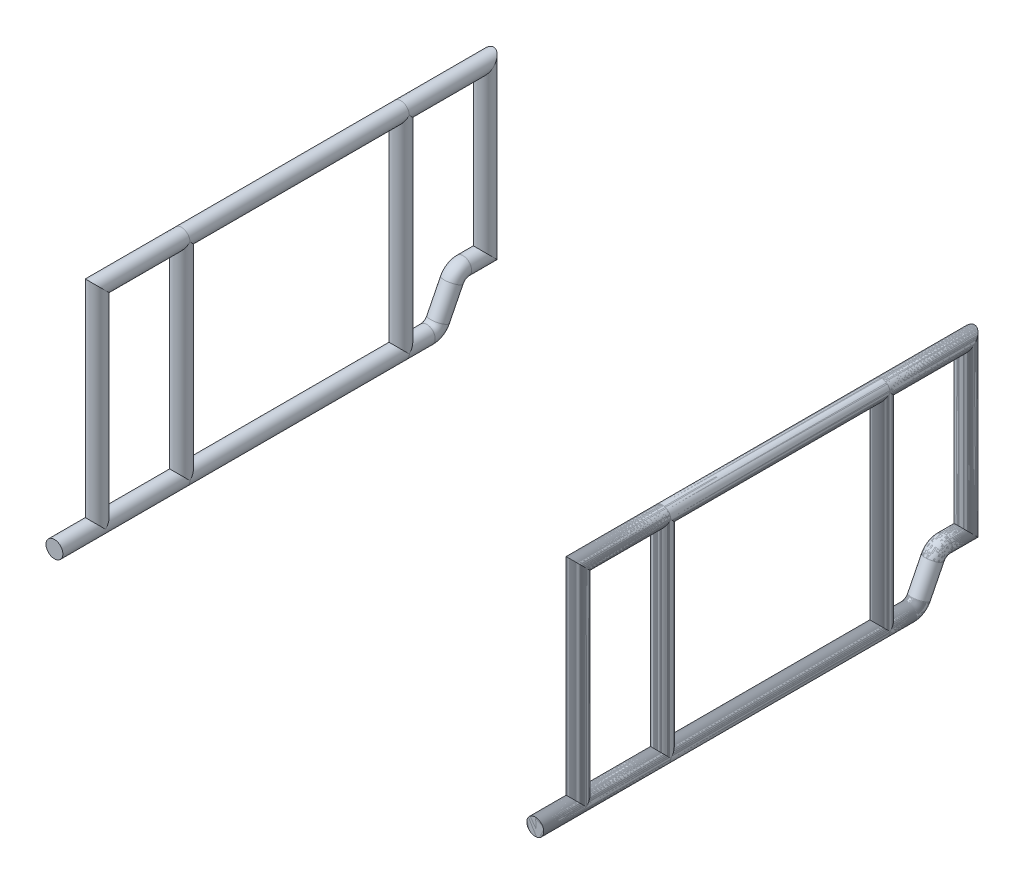
ISO-10303-21;
HEADER;
FILE_DESCRIPTION(('STEP AP214'),'2;1');
FILE_NAME('part.step','',(''),(''),'','','');
FILE_SCHEMA(('AUTOMOTIVE_DESIGN { 1 0 10303 214 1 1 1 1 }'));
ENDSEC;
DATA;
#1=APPLICATION_CONTEXT('core data for automotive mechanical design processes');
#2=APPLICATION_PROTOCOL_DEFINITION('international standard','automotive_design',2000,#1);
#3=PRODUCT_CONTEXT('',#1,'mechanical');
#4=PRODUCT('Part','Part','',(#3));
#5=PRODUCT_RELATED_PRODUCT_CATEGORY('part','',(#4));
#6=PRODUCT_DEFINITION_FORMATION('','',#4);
#7=PRODUCT_DEFINITION_CONTEXT('part definition',#1,'design');
#8=PRODUCT_DEFINITION('design','',#6,#7);
#9=PRODUCT_DEFINITION_SHAPE('','',#8);
#10=(LENGTH_UNIT() NAMED_UNIT(*) SI_UNIT(.MILLI.,.METRE.));
#11=(NAMED_UNIT(*) PLANE_ANGLE_UNIT() SI_UNIT($,.RADIAN.));
#12=(NAMED_UNIT(*) SI_UNIT($,.STERADIAN.) SOLID_ANGLE_UNIT());
#13=UNCERTAINTY_MEASURE_WITH_UNIT(LENGTH_MEASURE(1.E-05),#10,'distance_accuracy_value','');
#14=(GEOMETRIC_REPRESENTATION_CONTEXT(3) GLOBAL_UNCERTAINTY_ASSIGNED_CONTEXT((#13)) GLOBAL_UNIT_ASSIGNED_CONTEXT((#10,
#11,#12)) REPRESENTATION_CONTEXT('',''));
#15=CARTESIAN_POINT('',(0.,0.,0.));
#16=DIRECTION('',(0.,0.,1.));
#17=DIRECTION('',(1.,0.,0.));
#18=AXIS2_PLACEMENT_3D('',#15,#16,#17);
#19=CARTESIAN_POINT('',(-570.,267.1,0.));
#20=DIRECTION('',(0.,-1.,0.));
#21=DIRECTION('',(0.,0.,-1.));
#22=AXIS2_PLACEMENT_3D('',#19,#20,#21);
#23=CYLINDRICAL_SURFACE('',#22,10.);
#24=CARTESIAN_POINT('',(-570.,245.,0.));
#25=DIRECTION('',(0.,0.707106781186548,-0.707106781186548));
#26=DIRECTION('',(0.,-0.707106781186548,-0.707106781186548));
#27=AXIS2_PLACEMENT_3D('',#24,#25,#26);
#28=ELLIPSE('',#27,14.1421356237309,10.);
#29=CARTESIAN_POINT('',(-570.,235.,-10.0000000000001));
#30=VERTEX_POINT('',#29);
#31=EDGE_CURVE('E134',#30,#30,#28,.T.);
#32=ORIENTED_EDGE('',*,*,#31,.F.);
#33=EDGE_LOOP('',(#32));
#34=FACE_BOUND('',#33,.T.);
#35=CARTESIAN_POINT('',(-570.,0.,0.));
#36=DIRECTION('',(0.,0.707106781186547,-0.707106781186547));
#37=DIRECTION('',(0.,-0.707106781186547,-0.707106781186547));
#38=AXIS2_PLACEMENT_3D('',#35,#36,#37);
#39=ELLIPSE('',#38,14.1421356237309,10.);
#40=CARTESIAN_POINT('',(-580.,0.,0.));
#41=VERTEX_POINT('',#40);
#42=CARTESIAN_POINT('',(-560.,0.,0.));
#43=VERTEX_POINT('',#42);
#44=EDGE_CURVE('E12',#41,#43,#39,.T.);
#45=ORIENTED_EDGE('',*,*,#44,.T.);
#46=CARTESIAN_POINT('',(-570.,0.,0.));
#47=DIRECTION('',(0.,0.707106781186547,0.707106781186547));
#48=DIRECTION('',(0.,0.707106781186548,-0.707106781186548));
#49=AXIS2_PLACEMENT_3D('',#46,#47,#48);
#50=ELLIPSE('',#49,14.142135623731,10.);
#51=EDGE_CURVE('E67',#43,#41,#50,.T.);
#52=ORIENTED_EDGE('',*,*,#51,.T.);
#53=EDGE_LOOP('',(#45,#52));
#54=FACE_BOUND('',#53,.T.);
#55=ADVANCED_FACE('F54',(#34,#54),#23,.T.);
#56=CARTESIAN_POINT('',(-570.,245.,-482.1));
#57=DIRECTION('',(0.,0.,1.));
#58=DIRECTION('',(-1.,0.,0.));
#59=AXIS2_PLACEMENT_3D('',#56,#57,#58);
#60=CYLINDRICAL_SURFACE('',#59,10.);
#61=CARTESIAN_POINT('',(-570.,245.,-460.));
#62=DIRECTION('',(0.,-0.707106781186547,-0.707106781186547));
#63=DIRECTION('',(0.,0.707106781186548,-0.707106781186548));
#64=AXIS2_PLACEMENT_3D('',#61,#62,#63);
#65=ELLIPSE('',#64,14.142135623731,10.);
#66=CARTESIAN_POINT('',(-570.,255.,-470.));
#67=VERTEX_POINT('',#66);
#68=EDGE_CURVE('E101',#67,#67,#65,.T.);
#69=ORIENTED_EDGE('',*,*,#68,.F.);
#70=EDGE_LOOP('',(#69));
#71=FACE_BOUND('',#70,.T.);
#72=CARTESIAN_POINT('',(-570.,245.,-360.));
#73=DIRECTION('',(0.,0.,1.));
#74=DIRECTION('',(-1.,0.,0.));
#75=AXIS2_PLACEMENT_3D('',#72,#73,#74);
#76=CIRCLE('',#75,10.);
#77=CARTESIAN_POINT('',(-560.,245.,-360.));
#78=VERTEX_POINT('',#77);
#79=CARTESIAN_POINT('',(-580.,245.,-360.));
#80=VERTEX_POINT('',#79);
#81=EDGE_CURVE('E130',#78,#80,#76,.T.);
#82=ORIENTED_EDGE('',*,*,#81,.F.);
#83=CARTESIAN_POINT('',(-570.,245.,-360.));
#84=DIRECTION('',(0.,0.707106781186547,-0.707106781186547));
#85=DIRECTION('',(0.,0.707106781186547,0.707106781186547));
#86=AXIS2_PLACEMENT_3D('',#83,#84,#85);
#87=ELLIPSE('',#86,14.142135623731,10.);
#88=EDGE_CURVE('E193',#80,#78,#87,.F.);
#89=ORIENTED_EDGE('',*,*,#88,.F.);
#90=EDGE_LOOP('',(#82,#89));
#91=FACE_BOUND('',#90,.T.);
#92=ADVANCED_FACE('F104',(#71,#91),#60,.T.);
#93=CARTESIAN_POINT('',(-570.,245.,-360.));
#94=DIRECTION('',(0.,0.,1.));
#95=DIRECTION('',(-1.,0.,0.));
#96=AXIS2_PLACEMENT_3D('',#93,#94,#95);
#97=CYLINDRICAL_SURFACE('',#96,10.);
#98=CARTESIAN_POINT('',(-570.,245.,-99.9999999999999));
#99=DIRECTION('',(0.,0.,1.));
#100=DIRECTION('',(-1.,0.,0.));
#101=AXIS2_PLACEMENT_3D('',#98,#99,#100);
#102=CIRCLE('',#101,10.);
#103=CARTESIAN_POINT('',(-560.,245.,-99.9999999999999));
#104=VERTEX_POINT('',#103);
#105=CARTESIAN_POINT('',(-580.,245.,-99.9999999999999));
#106=VERTEX_POINT('',#105);
#107=EDGE_CURVE('E127',#104,#106,#102,.T.);
#108=ORIENTED_EDGE('',*,*,#107,.F.);
#109=CARTESIAN_POINT('',(-570.,245.,-100.));
#110=DIRECTION('',(0.,0.707106781186547,-0.707106781186547));
#111=DIRECTION('',(0.,0.707106781186547,0.707106781186547));
#112=AXIS2_PLACEMENT_3D('',#109,#110,#111);
#113=ELLIPSE('',#112,14.1421356237309,10.);
#114=EDGE_CURVE('E132',#106,#104,#113,.F.);
#115=ORIENTED_EDGE('',*,*,#114,.F.);
#116=EDGE_LOOP('',(#108,#115));
#117=FACE_BOUND('',#116,.T.);
#118=ORIENTED_EDGE('',*,*,#81,.T.);
#119=CARTESIAN_POINT('',(-570.,245.,-360.));
#120=DIRECTION('',(0.,-0.707106781186547,-0.707106781186547));
#121=DIRECTION('',(0.,-0.707106781186547,0.707106781186547));
#122=AXIS2_PLACEMENT_3D('',#119,#120,#121);
#123=ELLIPSE('',#122,14.142135623731,10.);
#124=EDGE_CURVE('E74',#78,#80,#123,.T.);
#125=ORIENTED_EDGE('',*,*,#124,.F.);
#126=EDGE_LOOP('',(#118,#125));
#127=FACE_BOUND('',#126,.T.);
#128=ADVANCED_FACE('F110',(#117,#127),#97,.T.);
#129=CARTESIAN_POINT('',(-570.,245.,-99.9999999999999));
#130=DIRECTION('',(0.,0.,1.));
#131=DIRECTION('',(-1.,0.,0.));
#132=AXIS2_PLACEMENT_3D('',#129,#130,#131);
#133=CYLINDRICAL_SURFACE('',#132,10.);
#134=ORIENTED_EDGE('',*,*,#107,.T.);
#135=CARTESIAN_POINT('',(-570.,245.,-100.));
#136=DIRECTION('',(0.,-0.707106781186547,-0.707106781186547));
#137=DIRECTION('',(0.,-0.707106781186547,0.707106781186547));
#138=AXIS2_PLACEMENT_3D('',#135,#136,#137);
#139=ELLIPSE('',#138,14.1421356237309,10.);
#140=EDGE_CURVE('E137',#104,#106,#139,.T.);
#141=ORIENTED_EDGE('',*,*,#140,.F.);
#142=EDGE_LOOP('',(#134,#141));
#143=FACE_BOUND('',#142,.T.);
#144=ORIENTED_EDGE('',*,*,#31,.T.);
#145=EDGE_LOOP('',(#144));
#146=FACE_BOUND('',#145,.T.);
#147=ADVANCED_FACE('F56',(#143,#146),#133,.T.);
#148=CARTESIAN_POINT('',(-570.,26.9,-460.));
#149=DIRECTION('',(0.,1.,0.));
#150=DIRECTION('',(0.,0.,1.));
#151=AXIS2_PLACEMENT_3D('',#148,#149,#150);
#152=CYLINDRICAL_SURFACE('',#151,10.);
#153=CARTESIAN_POINT('',(-570.,49.,-460.));
#154=DIRECTION('',(0.,-0.707106781186547,0.707106781186547));
#155=DIRECTION('',(0.,-0.707106781186548,-0.707106781186548));
#156=AXIS2_PLACEMENT_3D('',#153,#154,#155);
#157=ELLIPSE('',#156,14.142135623731,10.);
#158=CARTESIAN_POINT('',(-570.,39.,-470.));
#159=VERTEX_POINT('',#158);
#160=EDGE_CURVE('E143',#159,#159,#157,.T.);
#161=ORIENTED_EDGE('',*,*,#160,.F.);
#162=EDGE_LOOP('',(#161));
#163=FACE_BOUND('',#162,.T.);
#164=ORIENTED_EDGE('',*,*,#68,.T.);
#165=EDGE_LOOP('',(#164));
#166=FACE_BOUND('',#165,.T.);
#167=ADVANCED_FACE('F115',(#163,#166),#152,.T.);
#168=CARTESIAN_POINT('',(-570.,0.,22.1));
#169=DIRECTION('',(0.,0.,-1.));
#170=DIRECTION('',(1.,0.,0.));
#171=AXIS2_PLACEMENT_3D('',#168,#169,#170);
#172=CYLINDRICAL_SURFACE('',#171,10.);
#173=ORIENTED_EDGE('',*,*,#51,.F.);
#174=ORIENTED_EDGE('',*,*,#44,.F.);
#175=EDGE_LOOP('',(#173,#174));
#176=FACE_BOUND('',#175,.T.);
#177=CARTESIAN_POINT('',(-570.,0.,-100.));
#178=DIRECTION('',(0.,0.,-1.));
#179=DIRECTION('',(-1.,0.,0.));
#180=AXIS2_PLACEMENT_3D('',#177,#178,#179);
#181=CIRCLE('',#180,10.);
#182=CARTESIAN_POINT('',(-560.,0.,-100.));
#183=VERTEX_POINT('',#182);
#184=CARTESIAN_POINT('',(-580.,0.,-100.));
#185=VERTEX_POINT('',#184);
#186=EDGE_CURVE('E100',#183,#185,#181,.T.);
#187=ORIENTED_EDGE('',*,*,#186,.F.);
#188=CARTESIAN_POINT('',(-570.,0.,-100.));
#189=DIRECTION('',(0.,-0.707106781186547,0.707106781186547));
#190=DIRECTION('',(0.,-0.707106781186547,-0.707106781186547));
#191=AXIS2_PLACEMENT_3D('',#188,#189,#190);
#192=ELLIPSE('',#191,14.1421356237309,10.);
#193=EDGE_CURVE('E190',#185,#183,#192,.F.);
#194=ORIENTED_EDGE('',*,*,#193,.F.);
#195=EDGE_LOOP('',(#187,#194));
#196=FACE_BOUND('',#195,.T.);
#197=CARTESIAN_POINT('',(-570.,0.,50.6581024421646));
#198=DIRECTION('',(0.,0.,-1.));
#199=DIRECTION('',(-1.,0.,0.));
#200=AXIS2_PLACEMENT_3D('',#197,#198,#199);
#201=CIRCLE('',#200,10.);
#202=CARTESIAN_POINT('',(-580.,0.,50.6581024421646));
#203=VERTEX_POINT('',#202);
#204=EDGE_CURVE('E156',#203,#203,#201,.T.);
#205=ORIENTED_EDGE('',*,*,#204,.T.);
#206=EDGE_LOOP('',(#205));
#207=FACE_BOUND('',#206,.T.);
#208=ADVANCED_FACE('F98',(#176,#196,#207),#172,.T.);
#209=CARTESIAN_POINT('',(-570.,0.,-100.));
#210=DIRECTION('',(0.,0.,-1.));
#211=DIRECTION('',(1.,0.,0.));
#212=AXIS2_PLACEMENT_3D('',#209,#210,#211);
#213=CYLINDRICAL_SURFACE('',#212,10.);
#214=CARTESIAN_POINT('',(-570.,0.,-360.));
#215=DIRECTION('',(0.,0.,-1.));
#216=DIRECTION('',(-1.,0.,0.));
#217=AXIS2_PLACEMENT_3D('',#214,#215,#216);
#218=CIRCLE('',#217,10.);
#219=CARTESIAN_POINT('',(-560.,0.,-360.));
#220=VERTEX_POINT('',#219);
#221=CARTESIAN_POINT('',(-580.,0.,-360.));
#222=VERTEX_POINT('',#221);
#223=EDGE_CURVE('E155',#220,#222,#218,.T.);
#224=ORIENTED_EDGE('',*,*,#223,.F.);
#225=CARTESIAN_POINT('',(-570.,0.,-360.));
#226=DIRECTION('',(0.,-0.707106781186547,0.707106781186547));
#227=DIRECTION('',(0.,-0.707106781186547,-0.707106781186547));
#228=AXIS2_PLACEMENT_3D('',#225,#226,#227);
#229=ELLIPSE('',#228,14.142135623731,10.);
#230=EDGE_CURVE('E148',#222,#220,#229,.F.);
#231=ORIENTED_EDGE('',*,*,#230,.F.);
#232=EDGE_LOOP('',(#224,#231));
#233=FACE_BOUND('',#232,.T.);
#234=ORIENTED_EDGE('',*,*,#186,.T.);
#235=CARTESIAN_POINT('',(-570.,0.,-100.));
#236=DIRECTION('',(0.,0.707106781186547,0.707106781186547));
#237=DIRECTION('',(0.,0.707106781186547,-0.707106781186547));
#238=AXIS2_PLACEMENT_3D('',#235,#236,#237);
#239=ELLIPSE('',#238,14.1421356237309,10.);
#240=EDGE_CURVE('E142',#183,#185,#239,.T.);
#241=ORIENTED_EDGE('',*,*,#240,.F.);
#242=EDGE_LOOP('',(#234,#241));
#243=FACE_BOUND('',#242,.T.);
#244=ADVANCED_FACE('F153',(#233,#243),#213,.T.);
#245=CARTESIAN_POINT('',(-570.,0.,-360.));
#246=DIRECTION('',(0.,0.,-1.));
#247=DIRECTION('',(1.,0.,0.));
#248=AXIS2_PLACEMENT_3D('',#245,#246,#247);
#249=CYLINDRICAL_SURFACE('',#248,10.);
#250=CARTESIAN_POINT('',(-570.,0.,-390.738546015918));
#251=DIRECTION('',(0.,0.,-1.));
#252=DIRECTION('',(-1.,0.,0.));
#253=AXIS2_PLACEMENT_3D('',#250,#251,#252);
#254=CIRCLE('',#253,10.);
#255=CARTESIAN_POINT('',(-570.,-10.,-390.738546015918));
#256=VERTEX_POINT('',#255);
#257=EDGE_CURVE('E159',#256,#256,#254,.T.);
#258=ORIENTED_EDGE('',*,*,#257,.F.);
#259=EDGE_LOOP('',(#258));
#260=FACE_BOUND('',#259,.T.);
#261=ORIENTED_EDGE('',*,*,#223,.T.);
#262=CARTESIAN_POINT('',(-570.,0.,-360.));
#263=DIRECTION('',(0.,0.707106781186547,0.707106781186547));
#264=DIRECTION('',(0.,0.707106781186547,-0.707106781186547));
#265=AXIS2_PLACEMENT_3D('',#262,#263,#264);
#266=ELLIPSE('',#265,14.142135623731,10.);
#267=EDGE_CURVE('E62',#220,#222,#266,.T.);
#268=ORIENTED_EDGE('',*,*,#267,.F.);
#269=EDGE_LOOP('',(#261,#268));
#270=FACE_BOUND('',#269,.T.);
#271=ADVANCED_FACE('F158',(#260,#270),#249,.T.);
#272=CARTESIAN_POINT('',(-570.,15.,-390.738546015918));
#273=DIRECTION('',(-1.,0.,0.));
#274=DIRECTION('',(0.,0.,-1.));
#275=AXIS2_PLACEMENT_3D('',#272,#273,#274);
#276=TOROIDAL_SURFACE('',#275,15.,10.);
#277=CARTESIAN_POINT('',(-570.,8.28007333101597,-404.14908610808));
#278=DIRECTION('',(0.,0.894036006144115,-0.447995111265602));
#279=DIRECTION('',(-1.,0.,0.));
#280=AXIS2_PLACEMENT_3D('',#277,#278,#279);
#281=CIRCLE('',#280,10.);
#282=CARTESIAN_POINT('',(-570.,3.80012221835996,-413.089446169521));
#283=VERTEX_POINT('',#282);
#284=EDGE_CURVE('E162',#283,#283,#281,.T.);
#285=CARTESIAN_POINT('',(-570.,15.,-390.738546015918));
#286=DIRECTION('',(-1.,0.,0.));
#287=DIRECTION('',(0.,0.,-1.));
#288=AXIS2_PLACEMENT_3D('',#285,#286,#287);
#289=CIRCLE('',#288,25.);
#290=EDGE_CURVE('',#283,#256,#289,.T.);
#291=ORIENTED_EDGE('',*,*,#284,.F.);
#292=ORIENTED_EDGE('',*,*,#257,.T.);
#293=ORIENTED_EDGE('',*,*,#290,.T.);
#294=ORIENTED_EDGE('',*,*,#290,.F.);
#295=EDGE_LOOP('',(#291,#293,#292,#294));
#296=FACE_BOUND('',#295,.T.);
#297=ADVANCED_FACE('F221',(#296),#276,.T.);
#298=CARTESIAN_POINT('',(-570.,8.28007333101597,-404.14908610808));
#299=DIRECTION('',(0.,0.894036006144113,-0.447995111265606));
#300=DIRECTION('',(0.,0.447995111265607,0.894036006144113));
#301=AXIS2_PLACEMENT_3D('',#298,#299,#300);
#302=CYLINDRICAL_SURFACE('',#301,10.);
#303=CARTESIAN_POINT('',(-570.,40.719926668984,-420.404466882129));
#304=DIRECTION('',(0.,0.894036006144113,-0.447995111265606));
#305=DIRECTION('',(-1.,0.,0.));
#306=AXIS2_PLACEMENT_3D('',#303,#304,#305);
#307=CIRCLE('',#306,10.);
#308=CARTESIAN_POINT('',(-570.,45.19987778164,-411.464106820688));
#309=VERTEX_POINT('',#308);
#310=EDGE_CURVE('E170',#309,#309,#307,.T.);
#311=ORIENTED_EDGE('',*,*,#310,.F.);
#312=EDGE_LOOP('',(#311));
#313=FACE_BOUND('',#312,.T.);
#314=ORIENTED_EDGE('',*,*,#284,.T.);
#315=EDGE_LOOP('',(#314));
#316=FACE_BOUND('',#315,.T.);
#317=ADVANCED_FACE('F225',(#313,#316),#302,.T.);
#318=CARTESIAN_POINT('',(-570.,34.,-433.815006974291));
#319=DIRECTION('',(1.,0.,0.));
#320=DIRECTION('',(0.,0.,1.));
#321=AXIS2_PLACEMENT_3D('',#318,#319,#320);
#322=TOROIDAL_SURFACE('',#321,15.,10.);
#323=CARTESIAN_POINT('',(-570.,49.,-433.815006974291));
#324=DIRECTION('',(0.,0.,-1.));
#325=DIRECTION('',(-1.,0.,0.));
#326=AXIS2_PLACEMENT_3D('',#323,#324,#325);
#327=CIRCLE('',#326,10.);
#328=CARTESIAN_POINT('',(-570.,59.,-433.815006974291));
#329=VERTEX_POINT('',#328);
#330=EDGE_CURVE('E173',#329,#329,#327,.T.);
#331=CARTESIAN_POINT('',(-570.,34.,-433.815006974291));
#332=DIRECTION('',(1.,0.,0.));
#333=DIRECTION('',(0.,0.,1.));
#334=AXIS2_PLACEMENT_3D('',#331,#332,#333);
#335=CIRCLE('',#334,25.);
#336=EDGE_CURVE('',#329,#309,#335,.T.);
#337=ORIENTED_EDGE('',*,*,#330,.F.);
#338=ORIENTED_EDGE('',*,*,#310,.T.);
#339=ORIENTED_EDGE('',*,*,#336,.T.);
#340=ORIENTED_EDGE('',*,*,#336,.F.);
#341=EDGE_LOOP('',(#337,#339,#338,#340));
#342=FACE_BOUND('',#341,.T.);
#343=ADVANCED_FACE('F215',(#342),#322,.T.);
#344=CARTESIAN_POINT('',(-570.,49.,-433.815006974291));
#345=DIRECTION('',(0.,0.,-1.));
#346=DIRECTION('',(1.,0.,0.));
#347=AXIS2_PLACEMENT_3D('',#344,#345,#346);
#348=CYLINDRICAL_SURFACE('',#347,10.);
#349=ORIENTED_EDGE('',*,*,#330,.T.);
#350=EDGE_LOOP('',(#349));
#351=FACE_BOUND('',#350,.T.);
#352=ORIENTED_EDGE('',*,*,#160,.T.);
#353=EDGE_LOOP('',(#352));
#354=FACE_BOUND('',#353,.T.);
#355=ADVANCED_FACE('F211',(#351,#354),#348,.T.);
#356=CARTESIAN_POINT('',(-570.,0.,-100.));
#357=DIRECTION('',(0.,1.,0.));
#358=DIRECTION('',(0.,0.,1.));
#359=AXIS2_PLACEMENT_3D('',#356,#357,#358);
#360=CYLINDRICAL_SURFACE('',#359,10.);
#361=ORIENTED_EDGE('',*,*,#193,.T.);
#362=ORIENTED_EDGE('',*,*,#240,.T.);
#363=EDGE_LOOP('',(#361,#362));
#364=FACE_BOUND('',#363,.T.);
#365=ORIENTED_EDGE('',*,*,#114,.T.);
#366=ORIENTED_EDGE('',*,*,#140,.T.);
#367=EDGE_LOOP('',(#365,#366));
#368=FACE_BOUND('',#367,.T.);
#369=ADVANCED_FACE('F206',(#364,#368),#360,.T.);
#370=CARTESIAN_POINT('',(-570.,0.,-360.));
#371=DIRECTION('',(0.,1.,0.));
#372=DIRECTION('',(0.,0.,1.));
#373=AXIS2_PLACEMENT_3D('',#370,#371,#372);
#374=CYLINDRICAL_SURFACE('',#373,10.);
#375=ORIENTED_EDGE('',*,*,#230,.T.);
#376=ORIENTED_EDGE('',*,*,#267,.T.);
#377=EDGE_LOOP('',(#375,#376));
#378=FACE_BOUND('',#377,.T.);
#379=ORIENTED_EDGE('',*,*,#88,.T.);
#380=ORIENTED_EDGE('',*,*,#124,.T.);
#381=EDGE_LOOP('',(#379,#380));
#382=FACE_BOUND('',#381,.T.);
#383=ADVANCED_FACE('F147',(#378,#382),#374,.T.);
#384=CARTESIAN_POINT('',(-570.,0.,50.6581024421646));
#385=DIRECTION('',(0.,0.,1.));
#386=DIRECTION('',(-1.,0.,0.));
#387=AXIS2_PLACEMENT_3D('',#384,#385,#386);
#388=PLANE('',#387);
#389=ORIENTED_EDGE('',*,*,#204,.F.);
#390=EDGE_LOOP('',(#389));
#391=FACE_BOUND('',#390,.T.);
#392=ADVANCED_FACE('F200',(#391),#388,.T.);
#393=CLOSED_SHELL('',(#55,#92,#128,#147,#167,#208,#244,#271,#297,#317,#343,#355,#369,#383,#392));
#394=MANIFOLD_SOLID_BREP('B2',#393);
#395=CARTESIAN_POINT('',(0.,267.1,0.));
#396=DIRECTION('',(0.,-1.,0.));
#397=DIRECTION('',(0.,0.,-1.));
#398=AXIS2_PLACEMENT_3D('',#395,#396,#397);
#399=CYLINDRICAL_SURFACE('',#398,10.);
#400=CARTESIAN_POINT('',(0.,245.,0.));
#401=DIRECTION('',(0.,0.707106781186548,-0.707106781186548));
#402=DIRECTION('',(0.,-0.707106781186548,-0.707106781186548));
#403=AXIS2_PLACEMENT_3D('',#400,#401,#402);
#404=ELLIPSE('',#403,14.1421356237309,10.);
#405=CARTESIAN_POINT('',(0.,235.,-10.0000000000001));
#406=VERTEX_POINT('',#405);
#407=EDGE_CURVE('E419',#406,#406,#404,.T.);
#408=ORIENTED_EDGE('',*,*,#407,.F.);
#409=EDGE_LOOP('',(#408));
#410=FACE_BOUND('',#409,.T.);
#411=CARTESIAN_POINT('',(0.,0.,0.));
#412=DIRECTION('',(0.,0.707106781186547,-0.707106781186547));
#413=DIRECTION('',(0.,-0.707106781186547,-0.707106781186547));
#414=AXIS2_PLACEMENT_3D('',#411,#412,#413);
#415=ELLIPSE('',#414,14.1421356237309,10.);
#416=CARTESIAN_POINT('',(-10.,0.,0.));
#417=VERTEX_POINT('',#416);
#418=CARTESIAN_POINT('',(10.,0.,0.));
#419=VERTEX_POINT('',#418);
#420=EDGE_CURVE('E52',#417,#419,#415,.T.);
#421=ORIENTED_EDGE('',*,*,#420,.T.);
#422=CARTESIAN_POINT('',(0.,0.,0.));
#423=DIRECTION('',(0.,0.707106781186547,0.707106781186547));
#424=DIRECTION('',(0.,0.707106781186548,-0.707106781186548));
#425=AXIS2_PLACEMENT_3D('',#422,#423,#424);
#426=ELLIPSE('',#425,14.142135623731,10.);
#427=EDGE_CURVE('E352',#419,#417,#426,.T.);
#428=ORIENTED_EDGE('',*,*,#427,.T.);
#429=EDGE_LOOP('',(#421,#428));
#430=FACE_BOUND('',#429,.T.);
#431=ADVANCED_FACE('F339',(#410,#430),#399,.T.);
#432=CARTESIAN_POINT('',(0.,245.,-482.1));
#433=DIRECTION('',(0.,0.,1.));
#434=DIRECTION('',(-1.,0.,0.));
#435=AXIS2_PLACEMENT_3D('',#432,#433,#434);
#436=CYLINDRICAL_SURFACE('',#435,10.);
#437=CARTESIAN_POINT('',(0.,245.,-460.));
#438=DIRECTION('',(0.,-0.707106781186547,-0.707106781186547));
#439=DIRECTION('',(0.,0.707106781186548,-0.707106781186548));
#440=AXIS2_PLACEMENT_3D('',#437,#438,#439);
#441=ELLIPSE('',#440,14.142135623731,10.);
#442=CARTESIAN_POINT('',(0.,255.,-470.));
#443=VERTEX_POINT('',#442);
#444=EDGE_CURVE('E386',#443,#443,#441,.T.);
#445=ORIENTED_EDGE('',*,*,#444,.F.);
#446=EDGE_LOOP('',(#445));
#447=FACE_BOUND('',#446,.T.);
#448=CARTESIAN_POINT('',(0.,245.,-360.));
#449=DIRECTION('',(0.,0.,1.));
#450=DIRECTION('',(-1.,0.,0.));
#451=AXIS2_PLACEMENT_3D('',#448,#449,#450);
#452=CIRCLE('',#451,10.);
#453=CARTESIAN_POINT('',(10.,245.,-360.));
#454=VERTEX_POINT('',#453);
#455=CARTESIAN_POINT('',(-10.,245.,-360.));
#456=VERTEX_POINT('',#455);
#457=EDGE_CURVE('E415',#454,#456,#452,.T.);
#458=ORIENTED_EDGE('',*,*,#457,.F.);
#459=CARTESIAN_POINT('',(0.,245.,-360.));
#460=DIRECTION('',(0.,0.707106781186547,-0.707106781186547));
#461=DIRECTION('',(0.,0.707106781186547,0.707106781186547));
#462=AXIS2_PLACEMENT_3D('',#459,#460,#461);
#463=ELLIPSE('',#462,14.142135623731,10.);
#464=EDGE_CURVE('E478',#456,#454,#463,.F.);
#465=ORIENTED_EDGE('',*,*,#464,.F.);
#466=EDGE_LOOP('',(#458,#465));
#467=FACE_BOUND('',#466,.T.);
#468=ADVANCED_FACE('F389',(#447,#467),#436,.T.);
#469=CARTESIAN_POINT('',(0.,245.,-360.));
#470=DIRECTION('',(0.,0.,1.));
#471=DIRECTION('',(-1.,0.,0.));
#472=AXIS2_PLACEMENT_3D('',#469,#470,#471);
#473=CYLINDRICAL_SURFACE('',#472,10.);
#474=CARTESIAN_POINT('',(0.,245.,-99.9999999999999));
#475=DIRECTION('',(0.,0.,1.));
#476=DIRECTION('',(-1.,0.,0.));
#477=AXIS2_PLACEMENT_3D('',#474,#475,#476);
#478=CIRCLE('',#477,10.);
#479=CARTESIAN_POINT('',(10.,245.,-99.9999999999999));
#480=VERTEX_POINT('',#479);
#481=CARTESIAN_POINT('',(-10.,245.,-99.9999999999999));
#482=VERTEX_POINT('',#481);
#483=EDGE_CURVE('E412',#480,#482,#478,.T.);
#484=ORIENTED_EDGE('',*,*,#483,.F.);
#485=CARTESIAN_POINT('',(0.,245.,-100.));
#486=DIRECTION('',(0.,0.707106781186547,-0.707106781186547));
#487=DIRECTION('',(0.,0.707106781186547,0.707106781186547));
#488=AXIS2_PLACEMENT_3D('',#485,#486,#487);
#489=ELLIPSE('',#488,14.1421356237309,10.);
#490=EDGE_CURVE('E417',#482,#480,#489,.F.);
#491=ORIENTED_EDGE('',*,*,#490,.F.);
#492=EDGE_LOOP('',(#484,#491));
#493=FACE_BOUND('',#492,.T.);
#494=ORIENTED_EDGE('',*,*,#457,.T.);
#495=CARTESIAN_POINT('',(0.,245.,-360.));
#496=DIRECTION('',(0.,-0.707106781186547,-0.707106781186547));
#497=DIRECTION('',(0.,-0.707106781186547,0.707106781186547));
#498=AXIS2_PLACEMENT_3D('',#495,#496,#497);
#499=ELLIPSE('',#498,14.142135623731,10.);
#500=EDGE_CURVE('E359',#454,#456,#499,.T.);
#501=ORIENTED_EDGE('',*,*,#500,.F.);
#502=EDGE_LOOP('',(#494,#501));
#503=FACE_BOUND('',#502,.T.);
#504=ADVANCED_FACE('F395',(#493,#503),#473,.T.);
#505=CARTESIAN_POINT('',(0.,245.,-99.9999999999999));
#506=DIRECTION('',(0.,0.,1.));
#507=DIRECTION('',(-1.,0.,0.));
#508=AXIS2_PLACEMENT_3D('',#505,#506,#507);
#509=CYLINDRICAL_SURFACE('',#508,10.);
#510=ORIENTED_EDGE('',*,*,#483,.T.);
#511=CARTESIAN_POINT('',(0.,245.,-100.));
#512=DIRECTION('',(0.,-0.707106781186547,-0.707106781186547));
#513=DIRECTION('',(0.,-0.707106781186547,0.707106781186547));
#514=AXIS2_PLACEMENT_3D('',#511,#512,#513);
#515=ELLIPSE('',#514,14.1421356237309,10.);
#516=EDGE_CURVE('E422',#480,#482,#515,.T.);
#517=ORIENTED_EDGE('',*,*,#516,.F.);
#518=EDGE_LOOP('',(#510,#517));
#519=FACE_BOUND('',#518,.T.);
#520=ORIENTED_EDGE('',*,*,#407,.T.);
#521=EDGE_LOOP('',(#520));
#522=FACE_BOUND('',#521,.T.);
#523=ADVANCED_FACE('F341',(#519,#522),#509,.T.);
#524=CARTESIAN_POINT('',(0.,26.9,-460.));
#525=DIRECTION('',(0.,1.,0.));
#526=DIRECTION('',(0.,0.,1.));
#527=AXIS2_PLACEMENT_3D('',#524,#525,#526);
#528=CYLINDRICAL_SURFACE('',#527,10.);
#529=CARTESIAN_POINT('',(0.,49.,-460.));
#530=DIRECTION('',(0.,-0.707106781186547,0.707106781186547));
#531=DIRECTION('',(0.,-0.707106781186548,-0.707106781186548));
#532=AXIS2_PLACEMENT_3D('',#529,#530,#531);
#533=ELLIPSE('',#532,14.142135623731,10.);
#534=CARTESIAN_POINT('',(0.,39.,-470.));
#535=VERTEX_POINT('',#534);
#536=EDGE_CURVE('E428',#535,#535,#533,.T.);
#537=ORIENTED_EDGE('',*,*,#536,.F.);
#538=EDGE_LOOP('',(#537));
#539=FACE_BOUND('',#538,.T.);
#540=ORIENTED_EDGE('',*,*,#444,.T.);
#541=EDGE_LOOP('',(#540));
#542=FACE_BOUND('',#541,.T.);
#543=ADVANCED_FACE('F400',(#539,#542),#528,.T.);
#544=CARTESIAN_POINT('',(0.,0.,22.1));
#545=DIRECTION('',(0.,0.,-1.));
#546=DIRECTION('',(1.,0.,0.));
#547=AXIS2_PLACEMENT_3D('',#544,#545,#546);
#548=CYLINDRICAL_SURFACE('',#547,10.);
#549=ORIENTED_EDGE('',*,*,#427,.F.);
#550=ORIENTED_EDGE('',*,*,#420,.F.);
#551=EDGE_LOOP('',(#549,#550));
#552=FACE_BOUND('',#551,.T.);
#553=CARTESIAN_POINT('',(0.,0.,-100.));
#554=DIRECTION('',(0.,0.,-1.));
#555=DIRECTION('',(-1.,0.,0.));
#556=AXIS2_PLACEMENT_3D('',#553,#554,#555);
#557=CIRCLE('',#556,10.);
#558=CARTESIAN_POINT('',(10.,0.,-100.));
#559=VERTEX_POINT('',#558);
#560=CARTESIAN_POINT('',(-10.,0.,-100.));
#561=VERTEX_POINT('',#560);
#562=EDGE_CURVE('E385',#559,#561,#557,.T.);
#563=ORIENTED_EDGE('',*,*,#562,.F.);
#564=CARTESIAN_POINT('',(0.,0.,-100.));
#565=DIRECTION('',(0.,-0.707106781186547,0.707106781186547));
#566=DIRECTION('',(0.,-0.707106781186547,-0.707106781186547));
#567=AXIS2_PLACEMENT_3D('',#564,#565,#566);
#568=ELLIPSE('',#567,14.1421356237309,10.);
#569=EDGE_CURVE('E475',#561,#559,#568,.F.);
#570=ORIENTED_EDGE('',*,*,#569,.F.);
#571=EDGE_LOOP('',(#563,#570));
#572=FACE_BOUND('',#571,.T.);
#573=CARTESIAN_POINT('',(0.,0.,50.6581024421646));
#574=DIRECTION('',(0.,0.,-1.));
#575=DIRECTION('',(-1.,0.,0.));
#576=AXIS2_PLACEMENT_3D('',#573,#574,#575);
#577=CIRCLE('',#576,10.);
#578=CARTESIAN_POINT('',(-10.,0.,50.6581024421646));
#579=VERTEX_POINT('',#578);
#580=EDGE_CURVE('E441',#579,#579,#577,.T.);
#581=ORIENTED_EDGE('',*,*,#580,.T.);
#582=EDGE_LOOP('',(#581));
#583=FACE_BOUND('',#582,.T.);
#584=ADVANCED_FACE('F383',(#552,#572,#583),#548,.T.);
#585=CARTESIAN_POINT('',(0.,0.,-100.));
#586=DIRECTION('',(0.,0.,-1.));
#587=DIRECTION('',(1.,0.,0.));
#588=AXIS2_PLACEMENT_3D('',#585,#586,#587);
#589=CYLINDRICAL_SURFACE('',#588,10.);
#590=CARTESIAN_POINT('',(0.,0.,-360.));
#591=DIRECTION('',(0.,0.,-1.));
#592=DIRECTION('',(-1.,0.,0.));
#593=AXIS2_PLACEMENT_3D('',#590,#591,#592);
#594=CIRCLE('',#593,10.);
#595=CARTESIAN_POINT('',(10.,0.,-360.));
#596=VERTEX_POINT('',#595);
#597=CARTESIAN_POINT('',(-10.,0.,-360.));
#598=VERTEX_POINT('',#597);
#599=EDGE_CURVE('E440',#596,#598,#594,.T.);
#600=ORIENTED_EDGE('',*,*,#599,.F.);
#601=CARTESIAN_POINT('',(0.,0.,-360.));
#602=DIRECTION('',(0.,-0.707106781186547,0.707106781186547));
#603=DIRECTION('',(0.,-0.707106781186547,-0.707106781186547));
#604=AXIS2_PLACEMENT_3D('',#601,#602,#603);
#605=ELLIPSE('',#604,14.142135623731,10.);
#606=EDGE_CURVE('E433',#598,#596,#605,.F.);
#607=ORIENTED_EDGE('',*,*,#606,.F.);
#608=EDGE_LOOP('',(#600,#607));
#609=FACE_BOUND('',#608,.T.);
#610=ORIENTED_EDGE('',*,*,#562,.T.);
#611=CARTESIAN_POINT('',(0.,0.,-100.));
#612=DIRECTION('',(0.,0.707106781186547,0.707106781186547));
#613=DIRECTION('',(0.,0.707106781186547,-0.707106781186547));
#614=AXIS2_PLACEMENT_3D('',#611,#612,#613);
#615=ELLIPSE('',#614,14.1421356237309,10.);
#616=EDGE_CURVE('E427',#559,#561,#615,.T.);
#617=ORIENTED_EDGE('',*,*,#616,.F.);
#618=EDGE_LOOP('',(#610,#617));
#619=FACE_BOUND('',#618,.T.);
#620=ADVANCED_FACE('F438',(#609,#619),#589,.T.);
#621=CARTESIAN_POINT('',(0.,0.,-360.));
#622=DIRECTION('',(0.,0.,-1.));
#623=DIRECTION('',(1.,0.,0.));
#624=AXIS2_PLACEMENT_3D('',#621,#622,#623);
#625=CYLINDRICAL_SURFACE('',#624,10.);
#626=CARTESIAN_POINT('',(0.,0.,-390.738546015918));
#627=DIRECTION('',(0.,0.,-1.));
#628=DIRECTION('',(-1.,0.,0.));
#629=AXIS2_PLACEMENT_3D('',#626,#627,#628);
#630=CIRCLE('',#629,10.);
#631=CARTESIAN_POINT('',(0.,-10.,-390.738546015918));
#632=VERTEX_POINT('',#631);
#633=EDGE_CURVE('E444',#632,#632,#630,.T.);
#634=ORIENTED_EDGE('',*,*,#633,.F.);
#635=EDGE_LOOP('',(#634));
#636=FACE_BOUND('',#635,.T.);
#637=ORIENTED_EDGE('',*,*,#599,.T.);
#638=CARTESIAN_POINT('',(0.,0.,-360.));
#639=DIRECTION('',(0.,0.707106781186547,0.707106781186547));
#640=DIRECTION('',(0.,0.707106781186547,-0.707106781186547));
#641=AXIS2_PLACEMENT_3D('',#638,#639,#640);
#642=ELLIPSE('',#641,14.142135623731,10.);
#643=EDGE_CURVE('E347',#596,#598,#642,.T.);
#644=ORIENTED_EDGE('',*,*,#643,.F.);
#645=EDGE_LOOP('',(#637,#644));
#646=FACE_BOUND('',#645,.T.);
#647=ADVANCED_FACE('F443',(#636,#646),#625,.T.);
#648=CARTESIAN_POINT('',(0.,15.,-390.738546015918));
#649=DIRECTION('',(-1.,0.,0.));
#650=DIRECTION('',(0.,0.,-1.));
#651=AXIS2_PLACEMENT_3D('',#648,#649,#650);
#652=TOROIDAL_SURFACE('',#651,15.,10.);
#653=CARTESIAN_POINT('',(0.,8.28007333101597,-404.14908610808));
#654=DIRECTION('',(0.,0.894036006144115,-0.447995111265602));
#655=DIRECTION('',(-1.,0.,0.));
#656=AXIS2_PLACEMENT_3D('',#653,#654,#655);
#657=CIRCLE('',#656,10.);
#658=CARTESIAN_POINT('',(0.,3.80012221835996,-413.089446169521));
#659=VERTEX_POINT('',#658);
#660=EDGE_CURVE('E447',#659,#659,#657,.T.);
#661=CARTESIAN_POINT('',(0.,15.,-390.738546015918));
#662=DIRECTION('',(-1.,0.,0.));
#663=DIRECTION('',(0.,0.,-1.));
#664=AXIS2_PLACEMENT_3D('',#661,#662,#663);
#665=CIRCLE('',#664,25.);
#666=EDGE_CURVE('',#659,#632,#665,.T.);
#667=ORIENTED_EDGE('',*,*,#660,.F.);
#668=ORIENTED_EDGE('',*,*,#633,.T.);
#669=ORIENTED_EDGE('',*,*,#666,.T.);
#670=ORIENTED_EDGE('',*,*,#666,.F.);
#671=EDGE_LOOP('',(#667,#669,#668,#670));
#672=FACE_BOUND('',#671,.T.);
#673=ADVANCED_FACE('F506',(#672),#652,.T.);
#674=CARTESIAN_POINT('',(0.,8.28007333101597,-404.14908610808));
#675=DIRECTION('',(0.,0.894036006144113,-0.447995111265606));
#676=DIRECTION('',(0.,0.447995111265607,0.894036006144113));
#677=AXIS2_PLACEMENT_3D('',#674,#675,#676);
#678=CYLINDRICAL_SURFACE('',#677,10.);
#679=CARTESIAN_POINT('',(0.,40.719926668984,-420.404466882129));
#680=DIRECTION('',(0.,0.894036006144113,-0.447995111265606));
#681=DIRECTION('',(-1.,0.,0.));
#682=AXIS2_PLACEMENT_3D('',#679,#680,#681);
#683=CIRCLE('',#682,10.);
#684=CARTESIAN_POINT('',(0.,45.19987778164,-411.464106820688));
#685=VERTEX_POINT('',#684);
#686=EDGE_CURVE('E455',#685,#685,#683,.T.);
#687=ORIENTED_EDGE('',*,*,#686,.F.);
#688=EDGE_LOOP('',(#687));
#689=FACE_BOUND('',#688,.T.);
#690=ORIENTED_EDGE('',*,*,#660,.T.);
#691=EDGE_LOOP('',(#690));
#692=FACE_BOUND('',#691,.T.);
#693=ADVANCED_FACE('F510',(#689,#692),#678,.T.);
#694=CARTESIAN_POINT('',(0.,34.,-433.815006974291));
#695=DIRECTION('',(1.,0.,0.));
#696=DIRECTION('',(0.,0.,1.));
#697=AXIS2_PLACEMENT_3D('',#694,#695,#696);
#698=TOROIDAL_SURFACE('',#697,15.,10.);
#699=CARTESIAN_POINT('',(0.,49.,-433.815006974291));
#700=DIRECTION('',(0.,0.,-1.));
#701=DIRECTION('',(-1.,0.,0.));
#702=AXIS2_PLACEMENT_3D('',#699,#700,#701);
#703=CIRCLE('',#702,10.);
#704=CARTESIAN_POINT('',(0.,59.,-433.815006974291));
#705=VERTEX_POINT('',#704);
#706=EDGE_CURVE('E458',#705,#705,#703,.T.);
#707=CARTESIAN_POINT('',(0.,34.,-433.815006974291));
#708=DIRECTION('',(1.,0.,0.));
#709=DIRECTION('',(0.,0.,1.));
#710=AXIS2_PLACEMENT_3D('',#707,#708,#709);
#711=CIRCLE('',#710,25.);
#712=EDGE_CURVE('',#705,#685,#711,.T.);
#713=ORIENTED_EDGE('',*,*,#706,.F.);
#714=ORIENTED_EDGE('',*,*,#686,.T.);
#715=ORIENTED_EDGE('',*,*,#712,.T.);
#716=ORIENTED_EDGE('',*,*,#712,.F.);
#717=EDGE_LOOP('',(#713,#715,#714,#716));
#718=FACE_BOUND('',#717,.T.);
#719=ADVANCED_FACE('F500',(#718),#698,.T.);
#720=CARTESIAN_POINT('',(0.,49.,-433.815006974291));
#721=DIRECTION('',(0.,0.,-1.));
#722=DIRECTION('',(1.,0.,0.));
#723=AXIS2_PLACEMENT_3D('',#720,#721,#722);
#724=CYLINDRICAL_SURFACE('',#723,10.);
#725=ORIENTED_EDGE('',*,*,#706,.T.);
#726=EDGE_LOOP('',(#725));
#727=FACE_BOUND('',#726,.T.);
#728=ORIENTED_EDGE('',*,*,#536,.T.);
#729=EDGE_LOOP('',(#728));
#730=FACE_BOUND('',#729,.T.);
#731=ADVANCED_FACE('F496',(#727,#730),#724,.T.);
#732=CARTESIAN_POINT('',(0.,0.,-100.));
#733=DIRECTION('',(0.,1.,0.));
#734=DIRECTION('',(0.,0.,1.));
#735=AXIS2_PLACEMENT_3D('',#732,#733,#734);
#736=CYLINDRICAL_SURFACE('',#735,10.);
#737=ORIENTED_EDGE('',*,*,#569,.T.);
#738=ORIENTED_EDGE('',*,*,#616,.T.);
#739=EDGE_LOOP('',(#737,#738));
#740=FACE_BOUND('',#739,.T.);
#741=ORIENTED_EDGE('',*,*,#490,.T.);
#742=ORIENTED_EDGE('',*,*,#516,.T.);
#743=EDGE_LOOP('',(#741,#742));
#744=FACE_BOUND('',#743,.T.);
#745=ADVANCED_FACE('F491',(#740,#744),#736,.T.);
#746=CARTESIAN_POINT('',(0.,0.,-360.));
#747=DIRECTION('',(0.,1.,0.));
#748=DIRECTION('',(0.,0.,1.));
#749=AXIS2_PLACEMENT_3D('',#746,#747,#748);
#750=CYLINDRICAL_SURFACE('',#749,10.);
#751=ORIENTED_EDGE('',*,*,#606,.T.);
#752=ORIENTED_EDGE('',*,*,#643,.T.);
#753=EDGE_LOOP('',(#751,#752));
#754=FACE_BOUND('',#753,.T.);
#755=ORIENTED_EDGE('',*,*,#464,.T.);
#756=ORIENTED_EDGE('',*,*,#500,.T.);
#757=EDGE_LOOP('',(#755,#756));
#758=FACE_BOUND('',#757,.T.);
#759=ADVANCED_FACE('F432',(#754,#758),#750,.T.);
#760=CARTESIAN_POINT('',(0.,0.,50.6581024421646));
#761=DIRECTION('',(0.,0.,1.));
#762=DIRECTION('',(-1.,0.,0.));
#763=AXIS2_PLACEMENT_3D('',#760,#761,#762);
#764=PLANE('',#763);
#765=ORIENTED_EDGE('',*,*,#580,.F.);
#766=EDGE_LOOP('',(#765));
#767=FACE_BOUND('',#766,.T.);
#768=ADVANCED_FACE('F485',(#767),#764,.T.);
#769=CLOSED_SHELL('',(#431,#468,#504,#523,#543,#584,#620,#647,#673,#693,#719,#731,#745,#759,#768));
#770=MANIFOLD_SOLID_BREP('B6',#769);
#771=CARTESIAN_POINT('',(0.,267.1,0.));
#772=DIRECTION('',(0.,-1.,0.));
#773=DIRECTION('',(0.,0.,-1.));
#774=AXIS2_PLACEMENT_3D('',#771,#772,#773);
#775=CYLINDRICAL_SURFACE('',#774,10.);
#776=CARTESIAN_POINT('',(0.,245.,0.));
#777=DIRECTION('',(0.,-0.707106781186548,0.707106781186548));
#778=DIRECTION('',(0.,-0.707106781186548,-0.707106781186548));
#779=AXIS2_PLACEMENT_3D('',#776,#777,#778);
#780=ELLIPSE('',#779,14.1421356237309,10.);
#781=CARTESIAN_POINT('',(0.,235.,-10.0000000000001));
#782=VERTEX_POINT('',#781);
#783=EDGE_CURVE('E715',#782,#782,#780,.T.);
#784=ORIENTED_EDGE('',*,*,#783,.T.);
#785=EDGE_LOOP('',(#784));
#786=FACE_BOUND('',#785,.T.);
#787=CARTESIAN_POINT('',(0.,0.,0.));
#788=DIRECTION('',(0.,-0.707106781186547,0.707106781186547));
#789=DIRECTION('',(0.,-0.707106781186547,-0.707106781186547));
#790=AXIS2_PLACEMENT_3D('',#787,#788,#789);
#791=ELLIPSE('',#790,14.1421356237309,10.);
#792=CARTESIAN_POINT('',(10.,0.,0.));
#793=VERTEX_POINT('',#792);
#794=CARTESIAN_POINT('',(-10.,0.,0.));
#795=VERTEX_POINT('',#794);
#796=EDGE_CURVE('E337',#793,#795,#791,.T.);
#797=ORIENTED_EDGE('',*,*,#796,.F.);
#798=CARTESIAN_POINT('',(0.,0.,0.));
#799=DIRECTION('',(0.,-0.707106781186547,-0.707106781186547));
#800=DIRECTION('',(0.,0.707106781186548,-0.707106781186548));
#801=AXIS2_PLACEMENT_3D('',#798,#799,#800);
#802=ELLIPSE('',#801,14.142135623731,10.);
#803=EDGE_CURVE('E657',#795,#793,#802,.T.);
#804=ORIENTED_EDGE('',*,*,#803,.F.);
#805=EDGE_LOOP('',(#797,#804));
#806=FACE_BOUND('',#805,.T.);
#807=ADVANCED_FACE('F615',(#786,#806),#775,.T.);
#808=CARTESIAN_POINT('',(0.,245.,-482.1));
#809=DIRECTION('',(0.,0.,1.));
#810=DIRECTION('',(1.,0.,0.));
#811=AXIS2_PLACEMENT_3D('',#808,#809,#810);
#812=CYLINDRICAL_SURFACE('',#811,10.);
#813=CARTESIAN_POINT('',(0.,245.,-460.));
#814=DIRECTION('',(0.,0.707106781186547,0.707106781186547));
#815=DIRECTION('',(0.,0.707106781186548,-0.707106781186548));
#816=AXIS2_PLACEMENT_3D('',#813,#814,#815);
#817=ELLIPSE('',#816,14.142135623731,10.);
#818=CARTESIAN_POINT('',(0.,255.,-470.));
#819=VERTEX_POINT('',#818);
#820=EDGE_CURVE('E660',#819,#819,#817,.T.);
#821=ORIENTED_EDGE('',*,*,#820,.T.);
#822=EDGE_LOOP('',(#821));
#823=FACE_BOUND('',#822,.T.);
#824=CARTESIAN_POINT('',(0.,245.,-360.));
#825=DIRECTION('',(0.,0.,-1.));
#826=DIRECTION('',(1.,0.,0.));
#827=AXIS2_PLACEMENT_3D('',#824,#825,#826);
#828=CIRCLE('',#827,10.);
#829=CARTESIAN_POINT('',(-10.,245.,-360.));
#830=VERTEX_POINT('',#829);
#831=CARTESIAN_POINT('',(10.,245.,-360.));
#832=VERTEX_POINT('',#831);
#833=EDGE_CURVE('E692',#830,#832,#828,.T.);
#834=ORIENTED_EDGE('',*,*,#833,.T.);
#835=CARTESIAN_POINT('',(0.,245.,-360.));
#836=DIRECTION('',(0.,-0.707106781186547,0.707106781186547));
#837=DIRECTION('',(0.,0.707106781186547,0.707106781186547));
#838=AXIS2_PLACEMENT_3D('',#835,#836,#837);
#839=ELLIPSE('',#838,14.142135623731,10.);
#840=EDGE_CURVE('E634',#832,#830,#839,.F.);
#841=ORIENTED_EDGE('',*,*,#840,.T.);
#842=EDGE_LOOP('',(#834,#841));
#843=FACE_BOUND('',#842,.T.);
#844=ADVANCED_FACE('F746',(#823,#843),#812,.T.);
#845=CARTESIAN_POINT('',(0.,245.,-360.));
#846=DIRECTION('',(0.,0.,1.));
#847=DIRECTION('',(1.,0.,0.));
#848=AXIS2_PLACEMENT_3D('',#845,#846,#847);
#849=CYLINDRICAL_SURFACE('',#848,10.);
#850=CARTESIAN_POINT('',(0.,245.,-99.9999999999999));
#851=DIRECTION('',(0.,0.,-1.));
#852=DIRECTION('',(1.,0.,0.));
#853=AXIS2_PLACEMENT_3D('',#850,#851,#852);
#854=CIRCLE('',#853,10.);
#855=CARTESIAN_POINT('',(-10.,245.,-99.9999999999999));
#856=VERTEX_POINT('',#855);
#857=CARTESIAN_POINT('',(10.,245.,-99.9999999999999));
#858=VERTEX_POINT('',#857);
#859=EDGE_CURVE('E718',#856,#858,#854,.T.);
#860=ORIENTED_EDGE('',*,*,#859,.T.);
#861=CARTESIAN_POINT('',(0.,245.,-100.));
#862=DIRECTION('',(0.,-0.707106781186547,0.707106781186547));
#863=DIRECTION('',(0.,0.707106781186547,0.707106781186547));
#864=AXIS2_PLACEMENT_3D('',#861,#862,#863);
#865=ELLIPSE('',#864,14.1421356237309,10.);
#866=EDGE_CURVE('E689',#858,#856,#865,.F.);
#867=ORIENTED_EDGE('',*,*,#866,.T.);
#868=EDGE_LOOP('',(#860,#867));
#869=FACE_BOUND('',#868,.T.);
#870=ORIENTED_EDGE('',*,*,#833,.F.);
#871=CARTESIAN_POINT('',(0.,245.,-360.));
#872=DIRECTION('',(0.,0.707106781186547,0.707106781186547));
#873=DIRECTION('',(0.,-0.707106781186547,0.707106781186547));
#874=AXIS2_PLACEMENT_3D('',#871,#872,#873);
#875=ELLIPSE('',#874,14.142135623731,10.);
#876=EDGE_CURVE('E679',#830,#832,#875,.T.);
#877=ORIENTED_EDGE('',*,*,#876,.T.);
#878=EDGE_LOOP('',(#870,#877));
#879=FACE_BOUND('',#878,.T.);
#880=ADVANCED_FACE('F752',(#869,#879),#849,.T.);
#881=CARTESIAN_POINT('',(0.,245.,-99.9999999999999));
#882=DIRECTION('',(0.,0.,1.));
#883=DIRECTION('',(1.,0.,0.));
#884=AXIS2_PLACEMENT_3D('',#881,#882,#883);
#885=CYLINDRICAL_SURFACE('',#884,10.);
#886=ORIENTED_EDGE('',*,*,#859,.F.);
#887=CARTESIAN_POINT('',(0.,245.,-100.));
#888=DIRECTION('',(0.,0.707106781186547,0.707106781186547));
#889=DIRECTION('',(0.,-0.707106781186547,0.707106781186547));
#890=AXIS2_PLACEMENT_3D('',#887,#888,#889);
#891=ELLIPSE('',#890,14.1421356237309,10.);
#892=EDGE_CURVE('E686',#856,#858,#891,.T.);
#893=ORIENTED_EDGE('',*,*,#892,.T.);
#894=EDGE_LOOP('',(#886,#893));
#895=FACE_BOUND('',#894,.T.);
#896=ORIENTED_EDGE('',*,*,#783,.F.);
#897=EDGE_LOOP('',(#896));
#898=FACE_BOUND('',#897,.T.);
#899=ADVANCED_FACE('F617',(#895,#898),#885,.T.);
#900=CARTESIAN_POINT('',(0.,26.9,-460.));
#901=DIRECTION('',(0.,1.,0.));
#902=DIRECTION('',(0.,0.,1.));
#903=AXIS2_PLACEMENT_3D('',#900,#901,#902);
#904=CYLINDRICAL_SURFACE('',#903,10.);
#905=CARTESIAN_POINT('',(0.,49.,-460.));
#906=DIRECTION('',(0.,0.707106781186547,-0.707106781186547));
#907=DIRECTION('',(0.,-0.707106781186548,-0.707106781186548));
#908=AXIS2_PLACEMENT_3D('',#905,#906,#907);
#909=ELLIPSE('',#908,14.142135623731,10.);
#910=CARTESIAN_POINT('',(0.,39.,-470.));
#911=VERTEX_POINT('',#910);
#912=EDGE_CURVE('E693',#911,#911,#909,.T.);
#913=ORIENTED_EDGE('',*,*,#912,.T.);
#914=EDGE_LOOP('',(#913));
#915=FACE_BOUND('',#914,.T.);
#916=ORIENTED_EDGE('',*,*,#820,.F.);
#917=EDGE_LOOP('',(#916));
#918=FACE_BOUND('',#917,.T.);
#919=ADVANCED_FACE('F666',(#915,#918),#904,.T.);
#920=CARTESIAN_POINT('',(0.,0.,22.1));
#921=DIRECTION('',(0.,0.,-1.));
#922=DIRECTION('',(-1.,0.,0.));
#923=AXIS2_PLACEMENT_3D('',#920,#921,#922);
#924=CYLINDRICAL_SURFACE('',#923,10.);
#925=ORIENTED_EDGE('',*,*,#803,.T.);
#926=ORIENTED_EDGE('',*,*,#796,.T.);
#927=EDGE_LOOP('',(#925,#926));
#928=FACE_BOUND('',#927,.T.);
#929=CARTESIAN_POINT('',(0.,0.,-100.));
#930=DIRECTION('',(0.,0.,1.));
#931=DIRECTION('',(1.,0.,0.));
#932=AXIS2_PLACEMENT_3D('',#929,#930,#931);
#933=CIRCLE('',#932,10.);
#934=CARTESIAN_POINT('',(-10.,0.,-100.));
#935=VERTEX_POINT('',#934);
#936=CARTESIAN_POINT('',(10.,0.,-100.));
#937=VERTEX_POINT('',#936);
#938=EDGE_CURVE('E659',#935,#937,#933,.T.);
#939=ORIENTED_EDGE('',*,*,#938,.T.);
#940=CARTESIAN_POINT('',(0.,0.,-100.));
#941=DIRECTION('',(0.,0.707106781186547,-0.707106781186547));
#942=DIRECTION('',(0.,-0.707106781186547,-0.707106781186547));
#943=AXIS2_PLACEMENT_3D('',#940,#941,#942);
#944=ELLIPSE('',#943,14.1421356237309,10.);
#945=EDGE_CURVE('E684',#937,#935,#944,.F.);
#946=ORIENTED_EDGE('',*,*,#945,.T.);
#947=EDGE_LOOP('',(#939,#946));
#948=FACE_BOUND('',#947,.T.);
#949=CARTESIAN_POINT('',(0.,0.,50.6581024421646));
#950=DIRECTION('',(0.,0.,1.));
#951=DIRECTION('',(1.,0.,0.));
#952=AXIS2_PLACEMENT_3D('',#949,#950,#951);
#953=CIRCLE('',#952,10.);
#954=CARTESIAN_POINT('',(10.,0.,50.6581024421646));
#955=VERTEX_POINT('',#954);
#956=EDGE_CURVE('E674',#955,#955,#953,.T.);
#957=ORIENTED_EDGE('',*,*,#956,.F.);
#958=EDGE_LOOP('',(#957));
#959=FACE_BOUND('',#958,.T.);
#960=ADVANCED_FACE('F662',(#928,#948,#959),#924,.T.);
#961=CARTESIAN_POINT('',(0.,0.,-100.));
#962=DIRECTION('',(0.,0.,-1.));
#963=DIRECTION('',(-1.,0.,0.));
#964=AXIS2_PLACEMENT_3D('',#961,#962,#963);
#965=CYLINDRICAL_SURFACE('',#964,10.);
#966=CARTESIAN_POINT('',(0.,0.,-360.));
#967=DIRECTION('',(0.,0.,1.));
#968=DIRECTION('',(1.,0.,0.));
#969=AXIS2_PLACEMENT_3D('',#966,#967,#968);
#970=CIRCLE('',#969,10.);
#971=CARTESIAN_POINT('',(-10.,0.,-360.));
#972=VERTEX_POINT('',#971);
#973=CARTESIAN_POINT('',(10.,0.,-360.));
#974=VERTEX_POINT('',#973);
#975=EDGE_CURVE('E699',#972,#974,#970,.T.);
#976=ORIENTED_EDGE('',*,*,#975,.T.);
#977=CARTESIAN_POINT('',(0.,0.,-360.));
#978=DIRECTION('',(0.,0.707106781186547,-0.707106781186547));
#979=DIRECTION('',(0.,-0.707106781186547,-0.707106781186547));
#980=AXIS2_PLACEMENT_3D('',#977,#978,#979);
#981=ELLIPSE('',#980,14.142135623731,10.);
#982=EDGE_CURVE('E676',#974,#972,#981,.F.);
#983=ORIENTED_EDGE('',*,*,#982,.T.);
#984=EDGE_LOOP('',(#976,#983));
#985=FACE_BOUND('',#984,.T.);
#986=ORIENTED_EDGE('',*,*,#938,.F.);
#987=CARTESIAN_POINT('',(0.,0.,-100.));
#988=DIRECTION('',(0.,-0.707106781186547,-0.707106781186547));
#989=DIRECTION('',(0.,0.707106781186547,-0.707106781186547));
#990=AXIS2_PLACEMENT_3D('',#987,#988,#989);
#991=ELLIPSE('',#990,14.1421356237309,10.);
#992=EDGE_CURVE('E696',#935,#937,#991,.T.);
#993=ORIENTED_EDGE('',*,*,#992,.T.);
#994=EDGE_LOOP('',(#986,#993));
#995=FACE_BOUND('',#994,.T.);
#996=ADVANCED_FACE('F665',(#985,#995),#965,.T.);
#997=CARTESIAN_POINT('',(0.,0.,-360.));
#998=DIRECTION('',(0.,0.,-1.));
#999=DIRECTION('',(-1.,0.,0.));
#1000=AXIS2_PLACEMENT_3D('',#997,#998,#999);
#1001=CYLINDRICAL_SURFACE('',#1000,10.);
#1002=CARTESIAN_POINT('',(0.,0.,-390.738546015918));
#1003=DIRECTION('',(0.,0.,1.));
#1004=DIRECTION('',(1.,0.,0.));
#1005=AXIS2_PLACEMENT_3D('',#1002,#1003,#1004);
#1006=CIRCLE('',#1005,10.);
#1007=CARTESIAN_POINT('',(0.,-10.,-390.738546015918));
#1008=VERTEX_POINT('',#1007);
#1009=EDGE_CURVE('E702',#1008,#1008,#1006,.T.);
#1010=ORIENTED_EDGE('',*,*,#1009,.T.);
#1011=EDGE_LOOP('',(#1010));
#1012=FACE_BOUND('',#1011,.T.);
#1013=ORIENTED_EDGE('',*,*,#975,.F.);
#1014=CARTESIAN_POINT('',(0.,0.,-360.));
#1015=DIRECTION('',(0.,-0.707106781186547,-0.707106781186547));
#1016=DIRECTION('',(0.,0.707106781186547,-0.707106781186547));
#1017=AXIS2_PLACEMENT_3D('',#1014,#1015,#1016);
#1018=ELLIPSE('',#1017,14.142135623731,10.);
#1019=EDGE_CURVE('E623',#972,#974,#1018,.T.);
#1020=ORIENTED_EDGE('',*,*,#1019,.T.);
#1021=EDGE_LOOP('',(#1013,#1020));
#1022=FACE_BOUND('',#1021,.T.);
#1023=ADVANCED_FACE('F727',(#1012,#1022),#1001,.T.);
#1024=CARTESIAN_POINT('',(0.,15.,-390.738546015918));
#1025=DIRECTION('',(1.,0.,0.));
#1026=DIRECTION('',(0.,0.,-1.));
#1027=AXIS2_PLACEMENT_3D('',#1024,#1025,#1026);
#1028=TOROIDAL_SURFACE('',#1027,15.,10.);
#1029=CARTESIAN_POINT('',(0.,8.28007333101597,-404.14908610808));
#1030=DIRECTION('',(0.,-0.894036006144115,0.447995111265602));
#1031=DIRECTION('',(1.,0.,0.));
#1032=AXIS2_PLACEMENT_3D('',#1029,#1030,#1031);
#1033=CIRCLE('',#1032,10.);
#1034=CARTESIAN_POINT('',(0.,3.80012221835996,-413.089446169521));
#1035=VERTEX_POINT('',#1034);
#1036=EDGE_CURVE('E705',#1035,#1035,#1033,.T.);
#1037=CARTESIAN_POINT('',(0.,15.,-390.738546015918));
#1038=DIRECTION('',(1.,0.,0.));
#1039=DIRECTION('',(0.,0.,-1.));
#1040=AXIS2_PLACEMENT_3D('',#1037,#1038,#1039);
#1041=CIRCLE('',#1040,25.);
#1042=EDGE_CURVE('',#1008,#1035,#1041,.T.);
#1043=ORIENTED_EDGE('',*,*,#1009,.F.);
#1044=ORIENTED_EDGE('',*,*,#1036,.T.);
#1045=ORIENTED_EDGE('',*,*,#1042,.T.);
#1046=ORIENTED_EDGE('',*,*,#1042,.F.);
#1047=EDGE_LOOP('',(#1043,#1045,#1044,#1046));
#1048=FACE_BOUND('',#1047,.T.);
#1049=ADVANCED_FACE('F773',(#1048),#1028,.T.);
#1050=CARTESIAN_POINT('',(0.,8.28007333101597,-404.14908610808));
#1051=DIRECTION('',(0.,0.894036006144113,-0.447995111265606));
#1052=DIRECTION('',(0.,0.447995111265607,0.894036006144113));
#1053=AXIS2_PLACEMENT_3D('',#1050,#1051,#1052);
#1054=CYLINDRICAL_SURFACE('',#1053,10.);
#1055=CARTESIAN_POINT('',(0.,40.719926668984,-420.404466882129));
#1056=DIRECTION('',(0.,-0.894036006144113,0.447995111265606));
#1057=DIRECTION('',(1.,0.,0.));
#1058=AXIS2_PLACEMENT_3D('',#1055,#1056,#1057);
#1059=CIRCLE('',#1058,10.);
#1060=CARTESIAN_POINT('',(0.,45.19987778164,-411.464106820688));
#1061=VERTEX_POINT('',#1060);
#1062=EDGE_CURVE('E708',#1061,#1061,#1059,.T.);
#1063=ORIENTED_EDGE('',*,*,#1062,.T.);
#1064=EDGE_LOOP('',(#1063));
#1065=FACE_BOUND('',#1064,.T.);
#1066=ORIENTED_EDGE('',*,*,#1036,.F.);
#1067=EDGE_LOOP('',(#1066));
#1068=FACE_BOUND('',#1067,.T.);
#1069=ADVANCED_FACE('F764',(#1065,#1068),#1054,.T.);
#1070=CARTESIAN_POINT('',(0.,34.,-433.815006974291));
#1071=DIRECTION('',(-1.,0.,0.));
#1072=DIRECTION('',(0.,0.,1.));
#1073=AXIS2_PLACEMENT_3D('',#1070,#1071,#1072);
#1074=TOROIDAL_SURFACE('',#1073,15.,10.);
#1075=CARTESIAN_POINT('',(0.,49.,-433.815006974291));
#1076=DIRECTION('',(0.,0.,1.));
#1077=DIRECTION('',(1.,0.,0.));
#1078=AXIS2_PLACEMENT_3D('',#1075,#1076,#1077);
#1079=CIRCLE('',#1078,10.);
#1080=CARTESIAN_POINT('',(0.,59.,-433.815006974291));
#1081=VERTEX_POINT('',#1080);
#1082=EDGE_CURVE('E697',#1081,#1081,#1079,.T.);
#1083=CARTESIAN_POINT('',(0.,34.,-433.815006974291));
#1084=DIRECTION('',(-1.,0.,0.));
#1085=DIRECTION('',(0.,0.,1.));
#1086=AXIS2_PLACEMENT_3D('',#1083,#1084,#1085);
#1087=CIRCLE('',#1086,25.);
#1088=EDGE_CURVE('',#1061,#1081,#1087,.T.);
#1089=ORIENTED_EDGE('',*,*,#1062,.F.);
#1090=ORIENTED_EDGE('',*,*,#1082,.T.);
#1091=ORIENTED_EDGE('',*,*,#1088,.T.);
#1092=ORIENTED_EDGE('',*,*,#1088,.F.);
#1093=EDGE_LOOP('',(#1089,#1091,#1090,#1092));
#1094=FACE_BOUND('',#1093,.T.);
#1095=ADVANCED_FACE('F757',(#1094),#1074,.T.);
#1096=CARTESIAN_POINT('',(0.,49.,-433.815006974291));
#1097=DIRECTION('',(0.,0.,-1.));
#1098=DIRECTION('',(-1.,0.,0.));
#1099=AXIS2_PLACEMENT_3D('',#1096,#1097,#1098);
#1100=CYLINDRICAL_SURFACE('',#1099,10.);
#1101=ORIENTED_EDGE('',*,*,#1082,.F.);
#1102=EDGE_LOOP('',(#1101));
#1103=FACE_BOUND('',#1102,.T.);
#1104=ORIENTED_EDGE('',*,*,#912,.F.);
#1105=EDGE_LOOP('',(#1104));
#1106=FACE_BOUND('',#1105,.T.);
#1107=ADVANCED_FACE('F743',(#1103,#1106),#1100,.T.);
#1108=CARTESIAN_POINT('',(0.,0.,-100.));
#1109=DIRECTION('',(0.,1.,0.));
#1110=DIRECTION('',(0.,0.,1.));
#1111=AXIS2_PLACEMENT_3D('',#1108,#1109,#1110);
#1112=CYLINDRICAL_SURFACE('',#1111,10.);
#1113=ORIENTED_EDGE('',*,*,#945,.F.);
#1114=ORIENTED_EDGE('',*,*,#992,.F.);
#1115=EDGE_LOOP('',(#1113,#1114));
#1116=FACE_BOUND('',#1115,.T.);
#1117=ORIENTED_EDGE('',*,*,#866,.F.);
#1118=ORIENTED_EDGE('',*,*,#892,.F.);
#1119=EDGE_LOOP('',(#1117,#1118));
#1120=FACE_BOUND('',#1119,.T.);
#1121=ADVANCED_FACE('F734',(#1116,#1120),#1112,.T.);
#1122=CARTESIAN_POINT('',(0.,0.,-360.));
#1123=DIRECTION('',(0.,1.,0.));
#1124=DIRECTION('',(0.,0.,1.));
#1125=AXIS2_PLACEMENT_3D('',#1122,#1123,#1124);
#1126=CYLINDRICAL_SURFACE('',#1125,10.);
#1127=ORIENTED_EDGE('',*,*,#982,.F.);
#1128=ORIENTED_EDGE('',*,*,#1019,.F.);
#1129=EDGE_LOOP('',(#1127,#1128));
#1130=FACE_BOUND('',#1129,.T.);
#1131=ORIENTED_EDGE('',*,*,#840,.F.);
#1132=ORIENTED_EDGE('',*,*,#876,.F.);
#1133=EDGE_LOOP('',(#1131,#1132));
#1134=FACE_BOUND('',#1133,.T.);
#1135=ADVANCED_FACE('F731',(#1130,#1134),#1126,.T.);
#1136=CARTESIAN_POINT('',(0.,0.,50.6581024421646));
#1137=DIRECTION('',(0.,0.,1.));
#1138=DIRECTION('',(1.,0.,0.));
#1139=AXIS2_PLACEMENT_3D('',#1136,#1137,#1138);
#1140=PLANE('',#1139);
#1141=ORIENTED_EDGE('',*,*,#956,.T.);
#1142=EDGE_LOOP('',(#1141));
#1143=FACE_BOUND('',#1142,.T.);
#1144=ADVANCED_FACE('F733',(#1143),#1140,.T.);
#1145=CLOSED_SHELL('',(#807,#844,#880,#899,#919,#960,#996,#1023,#1049,#1069,#1095,#1107,#1121,
#1135,#1144));
#1146=MANIFOLD_SOLID_BREP('B46',#1145);
#1147=ADVANCED_BREP_SHAPE_REPRESENTATION('',(#18,#394,#770,#1146),#14);
#1148=SHAPE_DEFINITION_REPRESENTATION(#9,#1147);
ENDSEC;
END-ISO-10303-21;
